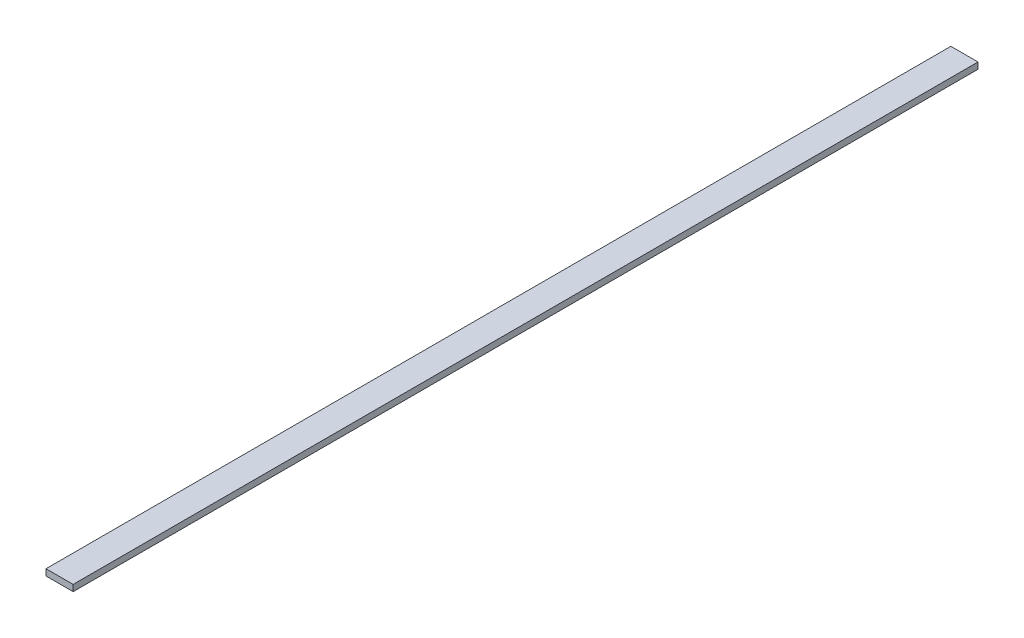
ISO-10303-21;
HEADER;
FILE_DESCRIPTION(('STEP AP214'),'2;1');
FILE_NAME('part.step','',(''),(''),'','','');
FILE_SCHEMA(('AUTOMOTIVE_DESIGN { 1 0 10303 214 1 1 1 1 }'));
ENDSEC;
DATA;
#1=APPLICATION_CONTEXT('core data for automotive mechanical design processes');
#2=APPLICATION_PROTOCOL_DEFINITION('international standard','automotive_design',2000,#1);
#3=PRODUCT_CONTEXT('',#1,'mechanical');
#4=PRODUCT('Part','Part','',(#3));
#5=PRODUCT_RELATED_PRODUCT_CATEGORY('part','',(#4));
#6=PRODUCT_DEFINITION_FORMATION('','',#4);
#7=PRODUCT_DEFINITION_CONTEXT('part definition',#1,'design');
#8=PRODUCT_DEFINITION('design','',#6,#7);
#9=PRODUCT_DEFINITION_SHAPE('','',#8);
#10=(LENGTH_UNIT() NAMED_UNIT(*) SI_UNIT(.MILLI.,.METRE.));
#11=(NAMED_UNIT(*) PLANE_ANGLE_UNIT() SI_UNIT($,.RADIAN.));
#12=(NAMED_UNIT(*) SI_UNIT($,.STERADIAN.) SOLID_ANGLE_UNIT());
#13=UNCERTAINTY_MEASURE_WITH_UNIT(LENGTH_MEASURE(1.E-05),#10,'distance_accuracy_value','');
#14=(GEOMETRIC_REPRESENTATION_CONTEXT(3) GLOBAL_UNCERTAINTY_ASSIGNED_CONTEXT((#13)) GLOBAL_UNIT_ASSIGNED_CONTEXT((#10,
#11,#12)) REPRESENTATION_CONTEXT('',''));
#15=CARTESIAN_POINT('',(0.,0.,0.));
#16=DIRECTION('',(0.,0.,1.));
#17=DIRECTION('',(1.,0.,0.));
#18=AXIS2_PLACEMENT_3D('',#15,#16,#17);
#19=CARTESIAN_POINT('',(-0.800928360360361,-0.230188072072072,100.));
#20=DIRECTION('',(1.,0.,0.));
#21=DIRECTION('',(0.,0.,-1.));
#22=AXIS2_PLACEMENT_3D('',#19,#20,#21);
#23=PLANE('',#22);
#24=DIRECTION('',(0.,-1.,0.));
#25=VECTOR('',#24,1.);
#26=CARTESIAN_POINT('',(-0.800928360360361,-0.230188072072072,0.));
#27=LINE('',#26,#25);
#28=CARTESIAN_POINT('',(-0.800928360360361,0.469835927927928,0.));
#29=VERTEX_POINT('',#28);
#30=CARTESIAN_POINT('',(-0.800928360360361,-0.230188072072072,0.));
#31=VERTEX_POINT('',#30);
#32=EDGE_CURVE('E99',#29,#31,#27,.T.);
#33=ORIENTED_EDGE('',*,*,#32,.T.);
#34=DIRECTION('',(0.,0.,-1.));
#35=VECTOR('',#34,1.);
#36=CARTESIAN_POINT('',(-0.800928360360361,-0.230188072072072,100.));
#37=LINE('',#36,#35);
#38=CARTESIAN_POINT('',(-0.800928360360361,-0.230188072072072,100.));
#39=VERTEX_POINT('',#38);
#40=EDGE_CURVE('E11',#39,#31,#37,.T.);
#41=ORIENTED_EDGE('',*,*,#40,.F.);
#42=DIRECTION('',(0.,-1.,0.));
#43=VECTOR('',#42,1.);
#44=CARTESIAN_POINT('',(-0.800928360360361,-0.230188072072072,100.));
#45=LINE('',#44,#43);
#46=CARTESIAN_POINT('',(-0.800928360360361,0.469835927927928,100.));
#47=VERTEX_POINT('',#46);
#48=EDGE_CURVE('E87',#47,#39,#45,.T.);
#49=ORIENTED_EDGE('',*,*,#48,.F.);
#50=DIRECTION('',(0.,0.,-1.));
#51=VECTOR('',#50,1.);
#52=CARTESIAN_POINT('',(-0.800928360360361,0.469835927927928,100.));
#53=LINE('',#52,#51);
#54=EDGE_CURVE('E95',#47,#29,#53,.T.);
#55=ORIENTED_EDGE('',*,*,#54,.T.);
#56=EDGE_LOOP('',(#33,#41,#49,#55));
#57=FACE_BOUND('',#56,.T.);
#58=ADVANCED_FACE('F36',(#57),#23,.F.);
#59=CARTESIAN_POINT('',(2.19906563963964,-0.230188072072072,100.));
#60=DIRECTION('',(0.,1.,0.));
#61=DIRECTION('',(-1.,0.,0.));
#62=AXIS2_PLACEMENT_3D('',#59,#60,#61);
#63=PLANE('',#62);
#64=DIRECTION('',(1.,0.,0.));
#65=VECTOR('',#64,1.);
#66=CARTESIAN_POINT('',(2.19906563963964,-0.230188072072072,0.));
#67=LINE('',#66,#65);
#68=CARTESIAN_POINT('',(2.19906563963964,-0.230188072072072,0.));
#69=VERTEX_POINT('',#68);
#70=EDGE_CURVE('E91',#31,#69,#67,.T.);
#71=ORIENTED_EDGE('',*,*,#70,.T.);
#72=DIRECTION('',(0.,0.,-1.));
#73=VECTOR('',#72,1.);
#74=CARTESIAN_POINT('',(2.19906563963964,-0.230188072072072,100.));
#75=LINE('',#74,#73);
#76=CARTESIAN_POINT('',(2.19906563963964,-0.230188072072072,100.));
#77=VERTEX_POINT('',#76);
#78=EDGE_CURVE('E44',#77,#69,#75,.T.);
#79=ORIENTED_EDGE('',*,*,#78,.F.);
#80=DIRECTION('',(1.,0.,0.));
#81=VECTOR('',#80,1.);
#82=CARTESIAN_POINT('',(2.19906563963964,-0.230188072072072,100.));
#83=LINE('',#82,#81);
#84=EDGE_CURVE('E82',#39,#77,#83,.T.);
#85=ORIENTED_EDGE('',*,*,#84,.F.);
#86=ORIENTED_EDGE('',*,*,#40,.T.);
#87=EDGE_LOOP('',(#71,#79,#85,#86));
#88=FACE_BOUND('',#87,.T.);
#89=ADVANCED_FACE('F90',(#88),#63,.F.);
#90=CARTESIAN_POINT('',(2.19906563963964,0.469835927927928,100.));
#91=DIRECTION('',(-1.,0.,0.));
#92=DIRECTION('',(0.,0.,1.));
#93=AXIS2_PLACEMENT_3D('',#90,#91,#92);
#94=PLANE('',#93);
#95=DIRECTION('',(0.,1.,0.));
#96=VECTOR('',#95,1.);
#97=CARTESIAN_POINT('',(2.19906563963964,0.469835927927928,0.));
#98=LINE('',#97,#96);
#99=CARTESIAN_POINT('',(2.19906563963964,0.469835927927928,0.));
#100=VERTEX_POINT('',#99);
#101=EDGE_CURVE('E69',#69,#100,#98,.T.);
#102=ORIENTED_EDGE('',*,*,#101,.T.);
#103=DIRECTION('',(0.,0.,-1.));
#104=VECTOR('',#103,1.);
#105=CARTESIAN_POINT('',(2.19906563963964,0.469835927927928,100.));
#106=LINE('',#105,#104);
#107=CARTESIAN_POINT('',(2.19906563963964,0.469835927927928,100.));
#108=VERTEX_POINT('',#107);
#109=EDGE_CURVE('E92',#108,#100,#106,.T.);
#110=ORIENTED_EDGE('',*,*,#109,.F.);
#111=DIRECTION('',(0.,1.,0.));
#112=VECTOR('',#111,1.);
#113=CARTESIAN_POINT('',(2.19906563963964,0.469835927927928,100.));
#114=LINE('',#113,#112);
#115=EDGE_CURVE('E85',#77,#108,#114,.T.);
#116=ORIENTED_EDGE('',*,*,#115,.F.);
#117=ORIENTED_EDGE('',*,*,#78,.T.);
#118=EDGE_LOOP('',(#102,#110,#116,#117));
#119=FACE_BOUND('',#118,.T.);
#120=ADVANCED_FACE('F93',(#119),#94,.F.);
#121=CARTESIAN_POINT('',(-0.800928360360361,0.469835927927928,100.));
#122=DIRECTION('',(0.,-1.,0.));
#123=DIRECTION('',(0.,0.,-1.));
#124=AXIS2_PLACEMENT_3D('',#121,#122,#123);
#125=PLANE('',#124);
#126=DIRECTION('',(-1.,0.,0.));
#127=VECTOR('',#126,1.);
#128=CARTESIAN_POINT('',(-0.800928360360361,0.469835927927928,0.));
#129=LINE('',#128,#127);
#130=EDGE_CURVE('E75',#100,#29,#129,.T.);
#131=ORIENTED_EDGE('',*,*,#130,.T.);
#132=ORIENTED_EDGE('',*,*,#54,.F.);
#133=DIRECTION('',(-1.,0.,0.));
#134=VECTOR('',#133,1.);
#135=CARTESIAN_POINT('',(-0.800928360360361,0.469835927927928,100.));
#136=LINE('',#135,#134);
#137=EDGE_CURVE('E52',#108,#47,#136,.T.);
#138=ORIENTED_EDGE('',*,*,#137,.F.);
#139=ORIENTED_EDGE('',*,*,#109,.T.);
#140=EDGE_LOOP('',(#131,#132,#138,#139));
#141=FACE_BOUND('',#140,.T.);
#142=ADVANCED_FACE('F106',(#141),#125,.F.);
#143=CARTESIAN_POINT('',(0.,0.,100.));
#144=DIRECTION('',(0.,0.,-1.));
#145=DIRECTION('',(-1.,0.,0.));
#146=AXIS2_PLACEMENT_3D('',#143,#144,#145);
#147=PLANE('',#146);
#148=ORIENTED_EDGE('',*,*,#48,.T.);
#149=ORIENTED_EDGE('',*,*,#84,.T.);
#150=ORIENTED_EDGE('',*,*,#115,.T.);
#151=ORIENTED_EDGE('',*,*,#137,.T.);
#152=EDGE_LOOP('',(#148,#149,#150,#151));
#153=FACE_BOUND('',#152,.T.);
#154=ADVANCED_FACE('F83',(#153),#147,.F.);
#155=CARTESIAN_POINT('',(0.,0.,0.));
#156=DIRECTION('',(0.,0.,-1.));
#157=DIRECTION('',(-1.,0.,0.));
#158=AXIS2_PLACEMENT_3D('',#155,#156,#157);
#159=PLANE('',#158);
#160=ORIENTED_EDGE('',*,*,#32,.F.);
#161=ORIENTED_EDGE('',*,*,#130,.F.);
#162=ORIENTED_EDGE('',*,*,#101,.F.);
#163=ORIENTED_EDGE('',*,*,#70,.F.);
#164=EDGE_LOOP('',(#160,#161,#162,#163));
#165=FACE_BOUND('',#164,.T.);
#166=ADVANCED_FACE('F109',(#165),#159,.T.);
#167=CLOSED_SHELL('',(#58,#89,#120,#142,#154,#166));
#168=MANIFOLD_SOLID_BREP('B2',#167);
#169=ADVANCED_BREP_SHAPE_REPRESENTATION('',(#18,#168),#14);
#170=SHAPE_DEFINITION_REPRESENTATION(#9,#169);
ENDSEC;
END-ISO-10303-21;
